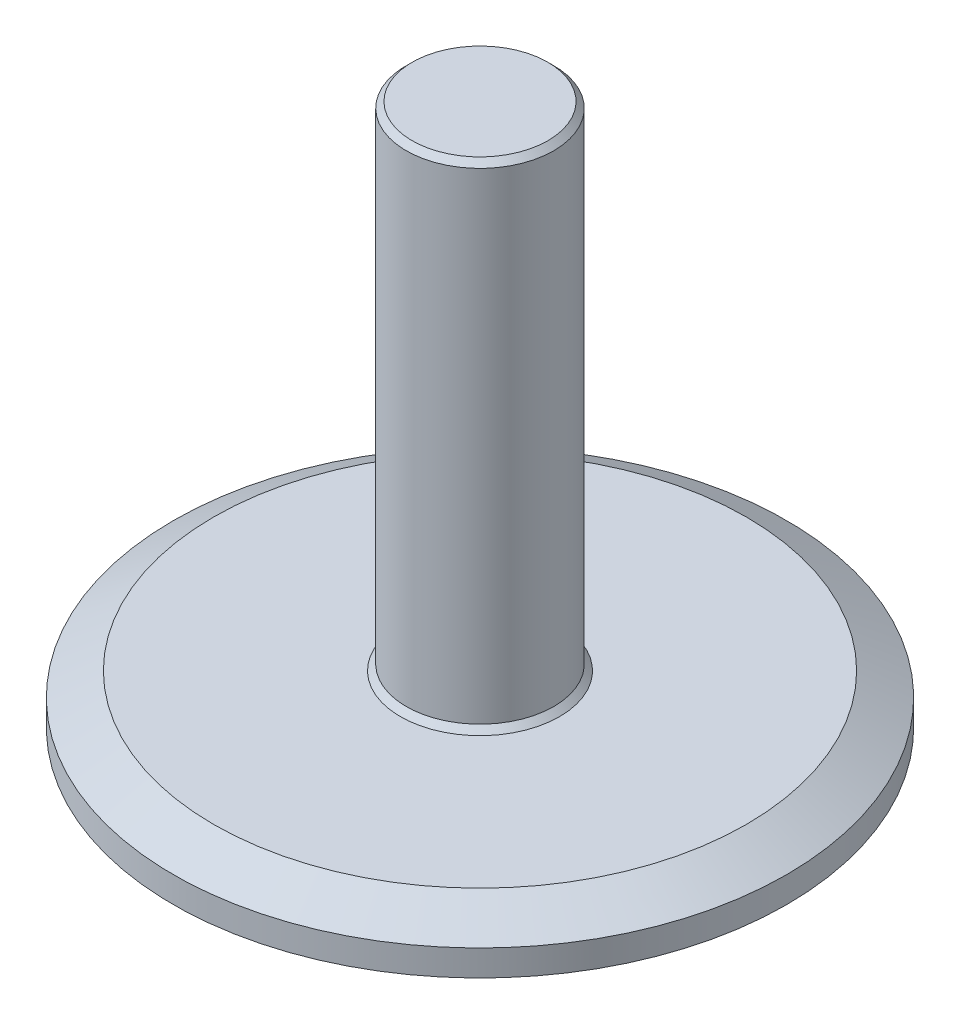
ISO-10303-21;
HEADER;
FILE_DESCRIPTION(('STEP AP214'),'2;1');
FILE_NAME('part.step','',(''),(''),'','','');
FILE_SCHEMA(('AUTOMOTIVE_DESIGN { 1 0 10303 214 1 1 1 1 }'));
ENDSEC;
DATA;
#1=APPLICATION_CONTEXT('core data for automotive mechanical design processes');
#2=APPLICATION_PROTOCOL_DEFINITION('international standard','automotive_design',2000,#1);
#3=PRODUCT_CONTEXT('',#1,'mechanical');
#4=PRODUCT('Part','Part','',(#3));
#5=PRODUCT_RELATED_PRODUCT_CATEGORY('part','',(#4));
#6=PRODUCT_DEFINITION_FORMATION('','',#4);
#7=PRODUCT_DEFINITION_CONTEXT('part definition',#1,'design');
#8=PRODUCT_DEFINITION('design','',#6,#7);
#9=PRODUCT_DEFINITION_SHAPE('','',#8);
#10=(LENGTH_UNIT() NAMED_UNIT(*) SI_UNIT(.MILLI.,.METRE.));
#11=(NAMED_UNIT(*) PLANE_ANGLE_UNIT() SI_UNIT($,.RADIAN.));
#12=(NAMED_UNIT(*) SI_UNIT($,.STERADIAN.) SOLID_ANGLE_UNIT());
#13=UNCERTAINTY_MEASURE_WITH_UNIT(LENGTH_MEASURE(1.E-05),#10,'distance_accuracy_value','');
#14=(GEOMETRIC_REPRESENTATION_CONTEXT(3) GLOBAL_UNCERTAINTY_ASSIGNED_CONTEXT((#13)) GLOBAL_UNIT_ASSIGNED_CONTEXT((#10,
#11,#12)) REPRESENTATION_CONTEXT('',''));
#15=CARTESIAN_POINT('',(0.,0.,0.));
#16=DIRECTION('',(0.,0.,1.));
#17=DIRECTION('',(1.,0.,0.));
#18=AXIS2_PLACEMENT_3D('',#15,#16,#17);
#19=CARTESIAN_POINT('',(-32.,0.,0.));
#20=DIRECTION('',(0.,1.,0.));
#21=DIRECTION('',(-1.,0.,0.));
#22=AXIS2_PLACEMENT_3D('',#19,#20,#21);
#23=PLANE('',#22);
#24=CARTESIAN_POINT('',(0.,0.,0.));
#25=DIRECTION('',(0.,-1.,0.));
#26=DIRECTION('',(0.,0.,-1.));
#27=AXIS2_PLACEMENT_3D('',#24,#25,#26);
#28=CIRCLE('',#27,2.7051);
#29=CARTESIAN_POINT('',(0.,0.,-2.7051));
#30=VERTEX_POINT('',#29);
#31=EDGE_CURVE('E61',#30,#30,#28,.T.);
#32=ORIENTED_EDGE('',*,*,#31,.F.);
#33=EDGE_LOOP('',(#32));
#34=FACE_BOUND('',#33,.T.);
#35=CARTESIAN_POINT('',(0.,0.,0.));
#36=DIRECTION('',(0.,-1.,0.));
#37=DIRECTION('',(1.,0.,0.));
#38=AXIS2_PLACEMENT_3D('',#35,#36,#37);
#39=CIRCLE('',#38,32.);
#40=CARTESIAN_POINT('',(32.,0.,0.));
#41=VERTEX_POINT('',#40);
#42=EDGE_CURVE('E60',#41,#41,#39,.T.);
#43=ORIENTED_EDGE('',*,*,#42,.T.);
#44=EDGE_LOOP('',(#43));
#45=FACE_BOUND('',#44,.T.);
#46=ADVANCED_FACE('F40',(#34,#45),#23,.F.);
#47=CARTESIAN_POINT('',(0.,70.85,0.));
#48=DIRECTION('',(0.,-1.,0.));
#49=DIRECTION('',(1.,0.,0.));
#50=AXIS2_PLACEMENT_3D('',#47,#48,#49);
#51=PLANE('',#50);
#52=CARTESIAN_POINT('',(0.,70.85,0.));
#53=DIRECTION('',(0.,-1.,0.));
#54=DIRECTION('',(1.,0.,0.));
#55=AXIS2_PLACEMENT_3D('',#52,#53,#54);
#56=CIRCLE('',#55,8.74999999999999);
#57=CARTESIAN_POINT('',(8.74999999999999,70.85,0.));
#58=VERTEX_POINT('',#57);
#59=EDGE_CURVE('E83',#58,#58,#56,.F.);
#60=ORIENTED_EDGE('',*,*,#59,.T.);
#61=EDGE_LOOP('',(#60));
#62=FACE_BOUND('',#61,.T.);
#63=ADVANCED_FACE('F101',(#62),#51,.F.);
#64=CARTESIAN_POINT('',(0.,0.,0.));
#65=DIRECTION('',(0.,-1.,0.));
#66=DIRECTION('',(1.,0.,0.));
#67=AXIS2_PLACEMENT_3D('',#64,#65,#66);
#68=CYLINDRICAL_SURFACE('',#67,9.49999999999999);
#69=CARTESIAN_POINT('',(0.,8.1,0.));
#70=DIRECTION('',(0.,-1.,0.));
#71=DIRECTION('',(1.,0.,0.));
#72=AXIS2_PLACEMENT_3D('',#69,#70,#71);
#73=CIRCLE('',#72,9.49999999999999);
#74=CARTESIAN_POINT('',(9.49999999999999,8.1,0.));
#75=VERTEX_POINT('',#74);
#76=EDGE_CURVE('E80',#75,#75,#73,.F.);
#77=ORIENTED_EDGE('',*,*,#76,.T.);
#78=EDGE_LOOP('',(#77));
#79=FACE_BOUND('',#78,.T.);
#80=CARTESIAN_POINT('',(0.,70.1,0.));
#81=DIRECTION('',(0.,-1.,0.));
#82=DIRECTION('',(1.,0.,0.));
#83=AXIS2_PLACEMENT_3D('',#80,#81,#82);
#84=CIRCLE('',#83,9.49999999999999);
#85=CARTESIAN_POINT('',(9.49999999999999,70.1,0.));
#86=VERTEX_POINT('',#85);
#87=EDGE_CURVE('E77',#86,#86,#84,.T.);
#88=ORIENTED_EDGE('',*,*,#87,.T.);
#89=EDGE_LOOP('',(#88));
#90=FACE_BOUND('',#89,.T.);
#91=ADVANCED_FACE('F107',(#79,#90),#68,.T.);
#92=CARTESIAN_POINT('',(-9.49999999999999,7.35,0.));
#93=DIRECTION('',(0.,-1.,0.));
#94=DIRECTION('',(1.,0.,0.));
#95=AXIS2_PLACEMENT_3D('',#92,#93,#94);
#96=PLANE('',#95);
#97=CARTESIAN_POINT('',(0.,7.35000000000001,0.));
#98=DIRECTION('',(0.,-1.,0.));
#99=DIRECTION('',(1.,0.,0.));
#100=AXIS2_PLACEMENT_3D('',#97,#98,#99);
#101=CIRCLE('',#100,34.3038475772934);
#102=CARTESIAN_POINT('',(34.3038475772934,7.35000000000001,0.));
#103=VERTEX_POINT('',#102);
#104=EDGE_CURVE('E11',#103,#103,#101,.F.);
#105=ORIENTED_EDGE('',*,*,#104,.T.);
#106=EDGE_LOOP('',(#105));
#107=FACE_BOUND('',#106,.T.);
#108=CARTESIAN_POINT('',(0.,7.35000000000001,0.));
#109=DIRECTION('',(0.,-1.,0.));
#110=DIRECTION('',(1.,0.,0.));
#111=AXIS2_PLACEMENT_3D('',#108,#109,#110);
#112=CIRCLE('',#111,10.25);
#113=CARTESIAN_POINT('',(10.25,7.35000000000001,0.));
#114=VERTEX_POINT('',#113);
#115=EDGE_CURVE('E74',#114,#114,#112,.T.);
#116=ORIENTED_EDGE('',*,*,#115,.T.);
#117=EDGE_LOOP('',(#116));
#118=FACE_BOUND('',#117,.T.);
#119=ADVANCED_FACE('F135',(#107,#118),#96,.F.);
#120=CARTESIAN_POINT('',(0.,0.,0.));
#121=DIRECTION('',(0.,-1.,0.));
#122=DIRECTION('',(1.,0.,0.));
#123=AXIS2_PLACEMENT_3D('',#120,#121,#122);
#124=CYLINDRICAL_SURFACE('',#123,39.5);
#125=CARTESIAN_POINT('',(0.,4.35,0.));
#126=DIRECTION('',(0.,-1.,0.));
#127=DIRECTION('',(1.,0.,0.));
#128=AXIS2_PLACEMENT_3D('',#125,#126,#127);
#129=CIRCLE('',#128,39.5);
#130=CARTESIAN_POINT('',(39.5,4.35,0.));
#131=VERTEX_POINT('',#130);
#132=EDGE_CURVE('E48',#131,#131,#129,.T.);
#133=ORIENTED_EDGE('',*,*,#132,.T.);
#134=EDGE_LOOP('',(#133));
#135=FACE_BOUND('',#134,.T.);
#136=CARTESIAN_POINT('',(0.,0.999999999999999,0.));
#137=DIRECTION('',(0.,-1.,0.));
#138=DIRECTION('',(1.,0.,0.));
#139=AXIS2_PLACEMENT_3D('',#136,#137,#138);
#140=CIRCLE('',#139,39.5);
#141=CARTESIAN_POINT('',(39.5,1.,0.));
#142=VERTEX_POINT('',#141);
#143=EDGE_CURVE('E71',#142,#142,#140,.T.);
#144=ORIENTED_EDGE('',*,*,#143,.F.);
#145=EDGE_LOOP('',(#144));
#146=FACE_BOUND('',#145,.T.);
#147=ADVANCED_FACE('F88',(#135,#146),#124,.T.);
#148=CARTESIAN_POINT('',(-39.5,0.999999999999999,0.));
#149=DIRECTION('',(0.,1.,0.));
#150=DIRECTION('',(-1.,0.,0.));
#151=AXIS2_PLACEMENT_3D('',#148,#149,#150);
#152=PLANE('',#151);
#153=CARTESIAN_POINT('',(0.,1.,0.));
#154=DIRECTION('',(0.,-1.,0.));
#155=DIRECTION('',(1.,0.,0.));
#156=AXIS2_PLACEMENT_3D('',#153,#154,#155);
#157=CIRCLE('',#156,32.);
#158=CARTESIAN_POINT('',(32.,1.,0.));
#159=VERTEX_POINT('',#158);
#160=EDGE_CURVE('E64',#159,#159,#157,.T.);
#161=ORIENTED_EDGE('',*,*,#160,.F.);
#162=EDGE_LOOP('',(#161));
#163=FACE_BOUND('',#162,.T.);
#164=ORIENTED_EDGE('',*,*,#143,.T.);
#165=EDGE_LOOP('',(#164));
#166=FACE_BOUND('',#165,.T.);
#167=ADVANCED_FACE('F128',(#163,#166),#152,.F.);
#168=CARTESIAN_POINT('',(0.,0.,0.));
#169=DIRECTION('',(0.,-1.,0.));
#170=DIRECTION('',(1.,0.,0.));
#171=AXIS2_PLACEMENT_3D('',#168,#169,#170);
#172=CYLINDRICAL_SURFACE('',#171,32.);
#173=ORIENTED_EDGE('',*,*,#42,.F.);
#174=EDGE_LOOP('',(#173));
#175=FACE_BOUND('',#174,.T.);
#176=ORIENTED_EDGE('',*,*,#160,.T.);
#177=EDGE_LOOP('',(#176));
#178=FACE_BOUND('',#177,.T.);
#179=ADVANCED_FACE('F119',(#175,#178),#172,.T.);
#180=CARTESIAN_POINT('',(0.,7.35000000000001,0.));
#181=DIRECTION('',(0.,-1.,0.));
#182=DIRECTION('',(1.,0.,0.));
#183=AXIS2_PLACEMENT_3D('',#180,#181,#182);
#184=CONICAL_SURFACE('',#183,10.25,0.785398163397453);
#185=CARTESIAN_POINT('',(9.49999999999999,8.1,0.));
#186=CARTESIAN_POINT('',(9.50781249999999,8.0921875,0.));
#187=CARTESIAN_POINT('',(9.51562499999999,8.084375,0.));
#188=CARTESIAN_POINT('',(9.53124999999999,8.06875,0.));
#189=CARTESIAN_POINT('',(9.53906249999999,8.0609375,0.));
#190=CARTESIAN_POINT('',(9.55468749999999,8.0453125,0.));
#191=CARTESIAN_POINT('',(9.56249999999999,8.0375,0.));
#192=CARTESIAN_POINT('',(9.57812499999999,8.021875,0.));
#193=CARTESIAN_POINT('',(9.58593749999999,8.0140625,0.));
#194=CARTESIAN_POINT('',(9.60156249999999,7.9984375,0.));
#195=CARTESIAN_POINT('',(9.60937499999999,7.990625,0.));
#196=CARTESIAN_POINT('',(9.62499999999999,7.975,0.));
#197=CARTESIAN_POINT('',(9.63281249999999,7.9671875,0.));
#198=CARTESIAN_POINT('',(9.64843749999999,7.9515625,0.));
#199=CARTESIAN_POINT('',(9.65624999999999,7.94375,0.));
#200=CARTESIAN_POINT('',(9.67187499999999,7.928125,0.));
#201=CARTESIAN_POINT('',(9.67968749999999,7.9203125,0.));
#202=CARTESIAN_POINT('',(9.6953125,7.9046875,0.));
#203=CARTESIAN_POINT('',(9.70312499999999,7.896875,0.));
#204=CARTESIAN_POINT('',(9.71874999999999,7.88125,0.));
#205=CARTESIAN_POINT('',(9.7265625,7.8734375,0.));
#206=CARTESIAN_POINT('',(9.74218749999999,7.8578125,0.));
#207=CARTESIAN_POINT('',(9.74999999999999,7.85,0.));
#208=CARTESIAN_POINT('',(9.76562499999999,7.834375,0.));
#209=CARTESIAN_POINT('',(9.77343749999999,7.8265625,0.));
#210=CARTESIAN_POINT('',(9.7890625,7.8109375,0.));
#211=CARTESIAN_POINT('',(9.79687499999999,7.803125,0.));
#212=CARTESIAN_POINT('',(9.81249999999999,7.7875,0.));
#213=CARTESIAN_POINT('',(9.8203125,7.7796875,0.));
#214=CARTESIAN_POINT('',(9.8359375,7.7640625,0.));
#215=CARTESIAN_POINT('',(9.84374999999999,7.75625,0.));
#216=CARTESIAN_POINT('',(9.85937499999999,7.740625,0.));
#217=CARTESIAN_POINT('',(9.8671875,7.7328125,0.));
#218=CARTESIAN_POINT('',(9.8828125,7.7171875,0.));
#219=CARTESIAN_POINT('',(9.89062499999999,7.709375,0.));
#220=CARTESIAN_POINT('',(9.90624999999999,7.69375,0.));
#221=CARTESIAN_POINT('',(9.9140625,7.6859375,0.));
#222=CARTESIAN_POINT('',(9.9296875,7.6703125,0.));
#223=CARTESIAN_POINT('',(9.93749999999999,7.6625,0.));
#224=CARTESIAN_POINT('',(9.95312499999999,7.646875,0.));
#225=CARTESIAN_POINT('',(9.9609375,7.6390625,0.));
#226=CARTESIAN_POINT('',(9.9765625,7.6234375,0.));
#227=CARTESIAN_POINT('',(9.98437499999999,7.615625,0.));
#228=CARTESIAN_POINT('',(9.99999999999999,7.6,0.));
#229=CARTESIAN_POINT('',(10.0078125,7.5921875,0.));
#230=CARTESIAN_POINT('',(10.0234375,7.5765625,0.));
#231=CARTESIAN_POINT('',(10.03125,7.56875,0.));
#232=CARTESIAN_POINT('',(10.046875,7.553125,0.));
#233=CARTESIAN_POINT('',(10.0546875,7.5453125,0.));
#234=CARTESIAN_POINT('',(10.0703125,7.5296875,0.));
#235=CARTESIAN_POINT('',(10.078125,7.521875,0.));
#236=CARTESIAN_POINT('',(10.09375,7.50625,0.));
#237=CARTESIAN_POINT('',(10.1015625,7.4984375,0.));
#238=CARTESIAN_POINT('',(10.1171875,7.4828125,0.));
#239=CARTESIAN_POINT('',(10.125,7.475,0.));
#240=CARTESIAN_POINT('',(10.140625,7.459375,0.));
#241=CARTESIAN_POINT('',(10.1484375,7.45156250000001,0.));
#242=CARTESIAN_POINT('',(10.1640625,7.43593750000001,0.));
#243=CARTESIAN_POINT('',(10.171875,7.42812500000001,0.));
#244=CARTESIAN_POINT('',(10.1875,7.41250000000001,0.));
#245=CARTESIAN_POINT('',(10.1953125,7.40468750000001,0.));
#246=CARTESIAN_POINT('',(10.2109375,7.38906250000001,0.));
#247=CARTESIAN_POINT('',(10.21875,7.38125000000001,0.));
#248=CARTESIAN_POINT('',(10.234375,7.36562500000001,0.));
#249=CARTESIAN_POINT('',(10.2421875,7.35781250000001,0.));
#250=CARTESIAN_POINT('',(10.25,7.35000000000001,0.));
#251=B_SPLINE_CURVE_WITH_KNOTS('',3,(#185,#186,#187,#188,#189,#190,#191,#192,#193,#194,#195,
#196,#197,#198,#199,#200,#201,#202,#203,#204,#205,#206,#207,#208,#209,#210,#211,#212,#213,#214,
#215,#216,#217,#218,#219,#220,#221,#222,#223,#224,#225,#226,#227,#228,#229,#230,#231,#232,#233,
#234,#235,#236,#237,#238,#239,#240,#241,#242,#243,#244,#245,#246,#247,#248,#249,#250),
.UNSPECIFIED.,.F.,.F.,(4,2,2,2,2,2,2,2,2,2,2,2,2,2,2,2,2,2,2,2,2,2,2,2,2,2,2,2,2,2,2,2,4),(0.,
0.0331456303681194,0.0662912607362389,0.0994368911043583,0.132582521472478,0.165728151840596,
0.198873782208717,0.232019412576835,0.265165042944956,0.298310673313075,0.331456303681193,
0.364601934049313,0.397747564417432,0.430893194785552,0.464038825153671,0.49718445552179,
0.530330085889909,0.563475716258029,0.596621346626148,0.629766976994268,0.662912607362387,
0.696058237730507,0.729203868098625,0.762349498466745,0.795495128834864,0.828640759202984,
0.861786389571103,0.894932019939223,0.928077650307341,0.961223280675461,0.99436891104358,
1.0275145414117,1.06066017177982),.UNSPECIFIED.);
#252=EDGE_CURVE('BSEAM97',#75,#114,#251,.T.);
#253=ORIENTED_EDGE('',*,*,#76,.F.);
#254=ORIENTED_EDGE('',*,*,#115,.F.);
#255=ORIENTED_EDGE('',*,*,#252,.T.);
#256=ORIENTED_EDGE('',*,*,#252,.F.);
#257=EDGE_LOOP('',(#253,#255,#254,#256));
#258=FACE_BOUND('',#257,.T.);
#259=ADVANCED_FACE('F97',(#258),#184,.T.);
#260=CARTESIAN_POINT('',(0.,70.1,0.));
#261=DIRECTION('',(0.,-1.,0.));
#262=DIRECTION('',(1.,0.,0.));
#263=AXIS2_PLACEMENT_3D('',#260,#261,#262);
#264=CONICAL_SURFACE('',#263,9.49999999999999,0.785398163397448);
#265=ORIENTED_EDGE('',*,*,#59,.F.);
#266=EDGE_LOOP('',(#265));
#267=FACE_BOUND('',#266,.T.);
#268=ORIENTED_EDGE('',*,*,#87,.F.);
#269=EDGE_LOOP('',(#268));
#270=FACE_BOUND('',#269,.T.);
#271=ADVANCED_FACE('F92',(#267,#270),#264,.T.);
#272=CARTESIAN_POINT('',(0.,4.35,0.));
#273=DIRECTION('',(0.,-1.,0.));
#274=DIRECTION('',(1.,0.,0.));
#275=AXIS2_PLACEMENT_3D('',#272,#273,#274);
#276=CONICAL_SURFACE('',#275,39.5,1.0471975511966);
#277=ORIENTED_EDGE('',*,*,#104,.F.);
#278=EDGE_LOOP('',(#277));
#279=FACE_BOUND('',#278,.T.);
#280=ORIENTED_EDGE('',*,*,#132,.F.);
#281=EDGE_LOOP('',(#280));
#282=FACE_BOUND('',#281,.T.);
#283=ADVANCED_FACE('F43',(#279,#282),#276,.T.);
#284=CARTESIAN_POINT('',(0.,19.,0.));
#285=DIRECTION('',(0.,-1.,0.));
#286=DIRECTION('',(0.,0.,-1.));
#287=AXIS2_PLACEMENT_3D('',#284,#285,#286);
#288=CONICAL_SURFACE('',#287,2.7051,1.02974425867665);
#289=CARTESIAN_POINT('',(0.,20.6253880605315,0.));
#290=VERTEX_POINT('',#289);
#291=VERTEX_LOOP('',#290);
#292=FACE_BOUND('',#291,.T.);
#293=CARTESIAN_POINT('',(0.,19.,0.));
#294=DIRECTION('',(0.,-1.,0.));
#295=DIRECTION('',(0.,0.,-1.));
#296=AXIS2_PLACEMENT_3D('',#293,#294,#295);
#297=CIRCLE('',#296,2.7051);
#298=CARTESIAN_POINT('',(0.,19.,-2.7051));
#299=VERTEX_POINT('',#298);
#300=EDGE_CURVE('E58',#299,#299,#297,.T.);
#301=ORIENTED_EDGE('',*,*,#300,.T.);
#302=EDGE_LOOP('',(#301));
#303=FACE_BOUND('',#302,.T.);
#304=ADVANCED_FACE('F51',(#292,#303),#288,.F.);
#305=CARTESIAN_POINT('',(0.,0.,0.));
#306=DIRECTION('',(0.,-1.,0.));
#307=DIRECTION('',(0.,0.,-1.));
#308=AXIS2_PLACEMENT_3D('',#305,#306,#307);
#309=CYLINDRICAL_SURFACE('',#308,2.7051);
#310=ORIENTED_EDGE('',*,*,#300,.F.);
#311=EDGE_LOOP('',(#310));
#312=FACE_BOUND('',#311,.T.);
#313=ORIENTED_EDGE('',*,*,#31,.T.);
#314=EDGE_LOOP('',(#313));
#315=FACE_BOUND('',#314,.T.);
#316=ADVANCED_FACE('F54',(#312,#315),#309,.F.);
#317=CLOSED_SHELL('',(#46,#63,#91,#119,#147,#167,#179,#259,#271,#283,#304,#316));
#318=MANIFOLD_SOLID_BREP('B2',#317);
#319=ADVANCED_BREP_SHAPE_REPRESENTATION('',(#18,#318),#14);
#320=SHAPE_DEFINITION_REPRESENTATION(#9,#319);
ENDSEC;
END-ISO-10303-21;
